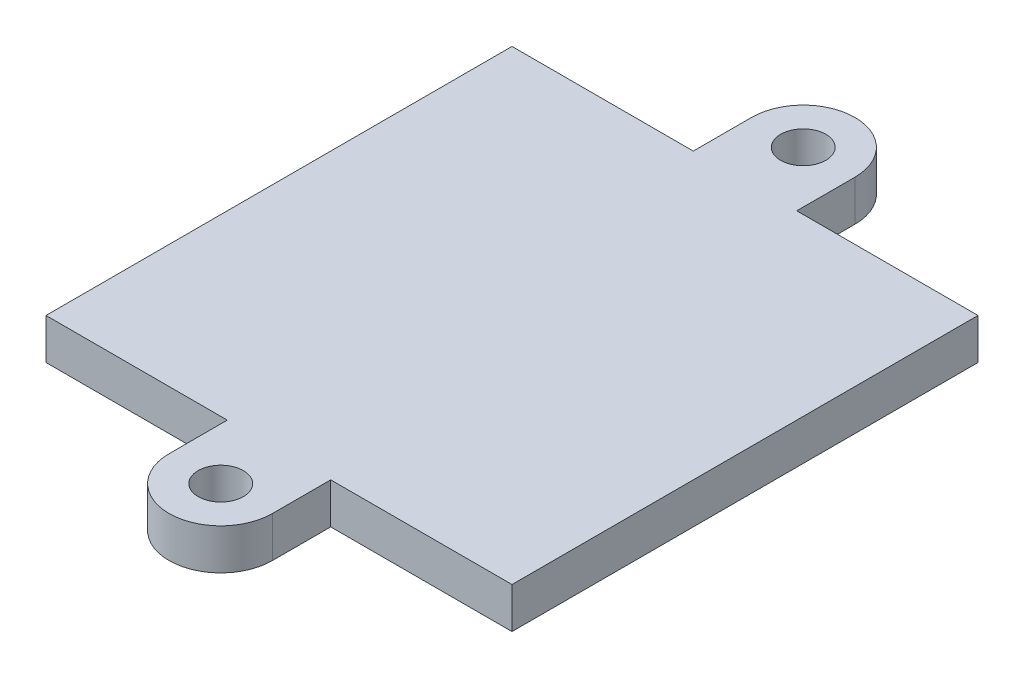
ISO-10303-21;
HEADER;
FILE_DESCRIPTION(('STEP AP214'),'2;1');
FILE_NAME('part.step','',(''),(''),'','','');
FILE_SCHEMA(('AUTOMOTIVE_DESIGN { 1 0 10303 214 1 1 1 1 }'));
ENDSEC;
DATA;
#1=APPLICATION_CONTEXT('core data for automotive mechanical design processes');
#2=APPLICATION_PROTOCOL_DEFINITION('international standard','automotive_design',2000,#1);
#3=PRODUCT_CONTEXT('',#1,'mechanical');
#4=PRODUCT('Part','Part','',(#3));
#5=PRODUCT_RELATED_PRODUCT_CATEGORY('part','',(#4));
#6=PRODUCT_DEFINITION_FORMATION('','',#4);
#7=PRODUCT_DEFINITION_CONTEXT('part definition',#1,'design');
#8=PRODUCT_DEFINITION('design','',#6,#7);
#9=PRODUCT_DEFINITION_SHAPE('','',#8);
#10=(LENGTH_UNIT() NAMED_UNIT(*) SI_UNIT(.MILLI.,.METRE.));
#11=(NAMED_UNIT(*) PLANE_ANGLE_UNIT() SI_UNIT($,.RADIAN.));
#12=(NAMED_UNIT(*) SI_UNIT($,.STERADIAN.) SOLID_ANGLE_UNIT());
#13=UNCERTAINTY_MEASURE_WITH_UNIT(LENGTH_MEASURE(1.E-05),#10,'distance_accuracy_value','');
#14=(GEOMETRIC_REPRESENTATION_CONTEXT(3) GLOBAL_UNCERTAINTY_ASSIGNED_CONTEXT((#13)) GLOBAL_UNIT_ASSIGNED_CONTEXT((#10,
#11,#12)) REPRESENTATION_CONTEXT('',''));
#15=CARTESIAN_POINT('',(0.,0.,0.));
#16=DIRECTION('',(0.,0.,1.));
#17=DIRECTION('',(1.,0.,0.));
#18=AXIS2_PLACEMENT_3D('',#15,#16,#17);
#19=CARTESIAN_POINT('',(0.,4.445,31.75));
#20=DIRECTION('',(0.,-1.,0.));
#21=DIRECTION('',(0.,0.,-1.));
#22=AXIS2_PLACEMENT_3D('',#19,#20,#21);
#23=CYLINDRICAL_SURFACE('',#22,5.6388);
#24=CARTESIAN_POINT('',(0.,0.,31.75));
#25=DIRECTION('',(0.,1.,0.));
#26=DIRECTION('',(0.,0.,1.));
#27=AXIS2_PLACEMENT_3D('',#24,#25,#26);
#28=CIRCLE('',#27,5.6388);
#29=CARTESIAN_POINT('',(5.6388,0.,31.75));
#30=VERTEX_POINT('',#29);
#31=CARTESIAN_POINT('',(-5.6388,0.,31.75));
#32=VERTEX_POINT('',#31);
#33=EDGE_CURVE('E157',#30,#32,#28,.F.);
#34=ORIENTED_EDGE('',*,*,#33,.F.);
#35=DIRECTION('',(0.,-1.,0.));
#36=VECTOR('',#35,1.);
#37=CARTESIAN_POINT('',(5.6388,4.445,31.75));
#38=LINE('',#37,#36);
#39=CARTESIAN_POINT('',(5.6388,4.445,31.75));
#40=VERTEX_POINT('',#39);
#41=EDGE_CURVE('E11',#40,#30,#38,.T.);
#42=ORIENTED_EDGE('',*,*,#41,.F.);
#43=CARTESIAN_POINT('',(0.,4.445,31.75));
#44=DIRECTION('',(0.,1.,0.));
#45=DIRECTION('',(0.,0.,1.));
#46=AXIS2_PLACEMENT_3D('',#43,#44,#45);
#47=CIRCLE('',#46,5.6388);
#48=CARTESIAN_POINT('',(-5.6388,4.445,31.75));
#49=VERTEX_POINT('',#48);
#50=EDGE_CURVE('E193',#40,#49,#47,.F.);
#51=ORIENTED_EDGE('',*,*,#50,.T.);
#52=DIRECTION('',(0.,-1.,0.));
#53=VECTOR('',#52,1.);
#54=CARTESIAN_POINT('',(-5.6388,4.445,31.75));
#55=LINE('',#54,#53);
#56=EDGE_CURVE('E49',#49,#32,#55,.T.);
#57=ORIENTED_EDGE('',*,*,#56,.T.);
#58=EDGE_LOOP('',(#34,#42,#51,#57));
#59=FACE_BOUND('',#58,.T.);
#60=ADVANCED_FACE('F33',(#59),#23,.T.);
#61=CARTESIAN_POINT('',(5.6388,4.445,0.));
#62=DIRECTION('',(-1.,0.,0.));
#63=DIRECTION('',(0.,0.,1.));
#64=AXIS2_PLACEMENT_3D('',#61,#62,#63);
#65=PLANE('',#64);
#66=DIRECTION('',(0.,0.,-1.));
#67=VECTOR('',#66,1.);
#68=CARTESIAN_POINT('',(5.6388,0.,0.));
#69=LINE('',#68,#67);
#70=CARTESIAN_POINT('',(5.6388,0.,25.3999999999999));
#71=VERTEX_POINT('',#70);
#72=EDGE_CURVE('E159',#30,#71,#69,.T.);
#73=ORIENTED_EDGE('',*,*,#72,.T.);
#74=DIRECTION('',(0.,-1.,0.));
#75=VECTOR('',#74,1.);
#76=CARTESIAN_POINT('',(5.6388,4.445,25.3999999999999));
#77=LINE('',#76,#75);
#78=CARTESIAN_POINT('',(5.6388,4.445,25.3999999999999));
#79=VERTEX_POINT('',#78);
#80=EDGE_CURVE('E41',#79,#71,#77,.T.);
#81=ORIENTED_EDGE('',*,*,#80,.F.);
#82=DIRECTION('',(0.,0.,-1.));
#83=VECTOR('',#82,1.);
#84=CARTESIAN_POINT('',(5.6388,4.445,0.));
#85=LINE('',#84,#83);
#86=EDGE_CURVE('E235',#40,#79,#85,.T.);
#87=ORIENTED_EDGE('',*,*,#86,.F.);
#88=ORIENTED_EDGE('',*,*,#41,.T.);
#89=EDGE_LOOP('',(#73,#81,#87,#88));
#90=FACE_BOUND('',#89,.T.);
#91=ADVANCED_FACE('F264',(#90),#65,.F.);
#92=CARTESIAN_POINT('',(-1.69458848553003E-13,4.445,25.3999999999999));
#93=DIRECTION('',(0.,0.,-1.));
#94=DIRECTION('',(-1.,0.,0.));
#95=AXIS2_PLACEMENT_3D('',#92,#93,#94);
#96=PLANE('',#95);
#97=DIRECTION('',(1.,0.,0.));
#98=VECTOR('',#97,1.);
#99=CARTESIAN_POINT('',(-1.69458848553003E-13,0.,25.3999999999999));
#100=LINE('',#99,#98);
#101=CARTESIAN_POINT('',(25.4000000000001,0.,25.4000000000001));
#102=VERTEX_POINT('',#101);
#103=EDGE_CURVE('E161',#71,#102,#100,.T.);
#104=ORIENTED_EDGE('',*,*,#103,.T.);
#105=DIRECTION('',(0.,-1.,0.));
#106=VECTOR('',#105,1.);
#107=CARTESIAN_POINT('',(25.4000000000001,4.445,25.4000000000001));
#108=LINE('',#107,#106);
#109=CARTESIAN_POINT('',(25.4000000000001,4.445,25.4000000000001));
#110=VERTEX_POINT('',#109);
#111=EDGE_CURVE('E208',#110,#102,#108,.T.);
#112=ORIENTED_EDGE('',*,*,#111,.F.);
#113=DIRECTION('',(1.,0.,0.));
#114=VECTOR('',#113,1.);
#115=CARTESIAN_POINT('',(-1.69458848553003E-13,4.445,25.3999999999999));
#116=LINE('',#115,#114);
#117=EDGE_CURVE('E216',#79,#110,#116,.T.);
#118=ORIENTED_EDGE('',*,*,#117,.F.);
#119=ORIENTED_EDGE('',*,*,#80,.T.);
#120=EDGE_LOOP('',(#104,#112,#118,#119));
#121=FACE_BOUND('',#120,.T.);
#122=ADVANCED_FACE('F214',(#121),#96,.F.);
#123=CARTESIAN_POINT('',(25.4000000000001,4.445,0.));
#124=DIRECTION('',(1.,0.,0.));
#125=DIRECTION('',(0.,0.,-1.));
#126=AXIS2_PLACEMENT_3D('',#123,#124,#125);
#127=PLANE('',#126);
#128=DIRECTION('',(0.,0.,1.));
#129=VECTOR('',#128,1.);
#130=CARTESIAN_POINT('',(25.4000000000001,0.,0.));
#131=LINE('',#130,#129);
#132=CARTESIAN_POINT('',(25.4000000000001,0.,-25.3999999999999));
#133=VERTEX_POINT('',#132);
#134=EDGE_CURVE('E164',#133,#102,#131,.T.);
#135=ORIENTED_EDGE('',*,*,#134,.F.);
#136=DIRECTION('',(0.,-1.,0.));
#137=VECTOR('',#136,1.);
#138=CARTESIAN_POINT('',(25.4000000000001,4.445,-25.3999999999999));
#139=LINE('',#138,#137);
#140=CARTESIAN_POINT('',(25.4000000000001,4.445,-25.3999999999999));
#141=VERTEX_POINT('',#140);
#142=EDGE_CURVE('E206',#141,#133,#139,.T.);
#143=ORIENTED_EDGE('',*,*,#142,.F.);
#144=DIRECTION('',(0.,0.,1.));
#145=VECTOR('',#144,1.);
#146=CARTESIAN_POINT('',(25.4000000000001,4.445,0.));
#147=LINE('',#146,#145);
#148=EDGE_CURVE('E228',#141,#110,#147,.T.);
#149=ORIENTED_EDGE('',*,*,#148,.T.);
#150=ORIENTED_EDGE('',*,*,#111,.T.);
#151=EDGE_LOOP('',(#135,#143,#149,#150));
#152=FACE_BOUND('',#151,.T.);
#153=ADVANCED_FACE('F225',(#152),#127,.T.);
#154=CARTESIAN_POINT('',(0.,4.445,-25.3999999999999));
#155=DIRECTION('',(0.,0.,-1.));
#156=DIRECTION('',(-1.,0.,0.));
#157=AXIS2_PLACEMENT_3D('',#154,#155,#156);
#158=PLANE('',#157);
#159=DIRECTION('',(1.,0.,0.));
#160=VECTOR('',#159,1.);
#161=CARTESIAN_POINT('',(0.,0.,-25.3999999999999));
#162=LINE('',#161,#160);
#163=CARTESIAN_POINT('',(5.6388,0.,-25.3999999999999));
#164=VERTEX_POINT('',#163);
#165=EDGE_CURVE('E167',#164,#133,#162,.T.);
#166=ORIENTED_EDGE('',*,*,#165,.F.);
#167=DIRECTION('',(0.,-1.,0.));
#168=VECTOR('',#167,1.);
#169=CARTESIAN_POINT('',(5.6388,4.445,-25.3999999999999));
#170=LINE('',#169,#168);
#171=CARTESIAN_POINT('',(5.6388,4.445,-25.3999999999999));
#172=VERTEX_POINT('',#171);
#173=EDGE_CURVE('E204',#172,#164,#170,.T.);
#174=ORIENTED_EDGE('',*,*,#173,.F.);
#175=DIRECTION('',(1.,0.,0.));
#176=VECTOR('',#175,1.);
#177=CARTESIAN_POINT('',(0.,4.445,-25.3999999999999));
#178=LINE('',#177,#176);
#179=EDGE_CURVE('E231',#172,#141,#178,.T.);
#180=ORIENTED_EDGE('',*,*,#179,.T.);
#181=ORIENTED_EDGE('',*,*,#142,.T.);
#182=EDGE_LOOP('',(#166,#174,#180,#181));
#183=FACE_BOUND('',#182,.T.);
#184=ADVANCED_FACE('F275',(#183),#158,.T.);
#185=CARTESIAN_POINT('',(5.6388,4.445,0.));
#186=DIRECTION('',(1.,0.,0.));
#187=DIRECTION('',(0.,0.,-1.));
#188=AXIS2_PLACEMENT_3D('',#185,#186,#187);
#189=PLANE('',#188);
#190=DIRECTION('',(0.,0.,1.));
#191=VECTOR('',#190,1.);
#192=CARTESIAN_POINT('',(5.6388,0.,0.));
#193=LINE('',#192,#191);
#194=CARTESIAN_POINT('',(5.6388,0.,-31.75));
#195=VERTEX_POINT('',#194);
#196=EDGE_CURVE('E170',#195,#164,#193,.T.);
#197=ORIENTED_EDGE('',*,*,#196,.F.);
#198=DIRECTION('',(0.,-1.,0.));
#199=VECTOR('',#198,1.);
#200=CARTESIAN_POINT('',(5.6388,4.445,-31.75));
#201=LINE('',#200,#199);
#202=CARTESIAN_POINT('',(5.6388,4.445,-31.75));
#203=VERTEX_POINT('',#202);
#204=EDGE_CURVE('E202',#203,#195,#201,.T.);
#205=ORIENTED_EDGE('',*,*,#204,.F.);
#206=DIRECTION('',(0.,0.,1.));
#207=VECTOR('',#206,1.);
#208=CARTESIAN_POINT('',(5.6388,4.445,0.));
#209=LINE('',#208,#207);
#210=EDGE_CURVE('E233',#203,#172,#209,.T.);
#211=ORIENTED_EDGE('',*,*,#210,.T.);
#212=ORIENTED_EDGE('',*,*,#173,.T.);
#213=EDGE_LOOP('',(#197,#205,#211,#212));
#214=FACE_BOUND('',#213,.T.);
#215=ADVANCED_FACE('F278',(#214),#189,.T.);
#216=CARTESIAN_POINT('',(0.,4.445,-31.75));
#217=DIRECTION('',(0.,-1.,0.));
#218=DIRECTION('',(0.,0.,-1.));
#219=AXIS2_PLACEMENT_3D('',#216,#217,#218);
#220=CYLINDRICAL_SURFACE('',#219,5.6388);
#221=CARTESIAN_POINT('',(0.,0.,-31.75));
#222=DIRECTION('',(0.,1.,0.));
#223=DIRECTION('',(0.,0.,1.));
#224=AXIS2_PLACEMENT_3D('',#221,#222,#223);
#225=CIRCLE('',#224,5.6388);
#226=CARTESIAN_POINT('',(-5.6388,0.,-31.75));
#227=VERTEX_POINT('',#226);
#228=EDGE_CURVE('E173',#195,#227,#225,.T.);
#229=ORIENTED_EDGE('',*,*,#228,.T.);
#230=DIRECTION('',(0.,-1.,0.));
#231=VECTOR('',#230,1.);
#232=CARTESIAN_POINT('',(-5.6388,4.445,-31.75));
#233=LINE('',#232,#231);
#234=CARTESIAN_POINT('',(-5.6388,4.445,-31.75));
#235=VERTEX_POINT('',#234);
#236=EDGE_CURVE('E199',#235,#227,#233,.T.);
#237=ORIENTED_EDGE('',*,*,#236,.F.);
#238=CARTESIAN_POINT('',(0.,4.445,-31.75));
#239=DIRECTION('',(0.,1.,0.));
#240=DIRECTION('',(0.,0.,1.));
#241=AXIS2_PLACEMENT_3D('',#238,#239,#240);
#242=CIRCLE('',#241,5.6388);
#243=EDGE_CURVE('E241',#203,#235,#242,.T.);
#244=ORIENTED_EDGE('',*,*,#243,.F.);
#245=ORIENTED_EDGE('',*,*,#204,.T.);
#246=EDGE_LOOP('',(#229,#237,#244,#245));
#247=FACE_BOUND('',#246,.T.);
#248=ADVANCED_FACE('F282',(#247),#220,.T.);
#249=CARTESIAN_POINT('',(-5.6388,4.445,0.));
#250=DIRECTION('',(1.,0.,0.));
#251=DIRECTION('',(0.,0.,-1.));
#252=AXIS2_PLACEMENT_3D('',#249,#250,#251);
#253=PLANE('',#252);
#254=DIRECTION('',(0.,0.,1.));
#255=VECTOR('',#254,1.);
#256=CARTESIAN_POINT('',(-5.6388,0.,0.));
#257=LINE('',#256,#255);
#258=CARTESIAN_POINT('',(-5.6388,0.,-25.3999999999999));
#259=VERTEX_POINT('',#258);
#260=EDGE_CURVE('E175',#227,#259,#257,.T.);
#261=ORIENTED_EDGE('',*,*,#260,.T.);
#262=DIRECTION('',(0.,-1.,0.));
#263=VECTOR('',#262,1.);
#264=CARTESIAN_POINT('',(-5.6388,4.445,-25.3999999999999));
#265=LINE('',#264,#263);
#266=CARTESIAN_POINT('',(-5.6388,4.445,-25.3999999999999));
#267=VERTEX_POINT('',#266);
#268=EDGE_CURVE('E197',#267,#259,#265,.T.);
#269=ORIENTED_EDGE('',*,*,#268,.F.);
#270=DIRECTION('',(0.,0.,1.));
#271=VECTOR('',#270,1.);
#272=CARTESIAN_POINT('',(-5.6388,4.445,0.));
#273=LINE('',#272,#271);
#274=EDGE_CURVE('E243',#235,#267,#273,.T.);
#275=ORIENTED_EDGE('',*,*,#274,.F.);
#276=ORIENTED_EDGE('',*,*,#236,.T.);
#277=EDGE_LOOP('',(#261,#269,#275,#276));
#278=FACE_BOUND('',#277,.T.);
#279=ADVANCED_FACE('F286',(#278),#253,.F.);
#280=CARTESIAN_POINT('',(0.,4.445,-25.3999999999999));
#281=DIRECTION('',(0.,0.,-1.));
#282=DIRECTION('',(-1.,0.,0.));
#283=AXIS2_PLACEMENT_3D('',#280,#281,#282);
#284=PLANE('',#283);
#285=DIRECTION('',(1.,0.,0.));
#286=VECTOR('',#285,1.);
#287=CARTESIAN_POINT('',(0.,0.,-25.3999999999999));
#288=LINE('',#287,#286);
#289=CARTESIAN_POINT('',(-25.4,0.,-25.3999999999999));
#290=VERTEX_POINT('',#289);
#291=EDGE_CURVE('E178',#290,#259,#288,.T.);
#292=ORIENTED_EDGE('',*,*,#291,.F.);
#293=DIRECTION('',(0.,-1.,0.));
#294=VECTOR('',#293,1.);
#295=CARTESIAN_POINT('',(-25.4,4.445,-25.3999999999999));
#296=LINE('',#295,#294);
#297=CARTESIAN_POINT('',(-25.4,4.445,-25.3999999999999));
#298=VERTEX_POINT('',#297);
#299=EDGE_CURVE('E143',#298,#290,#296,.T.);
#300=ORIENTED_EDGE('',*,*,#299,.F.);
#301=DIRECTION('',(1.,0.,0.));
#302=VECTOR('',#301,1.);
#303=CARTESIAN_POINT('',(0.,4.445,-25.3999999999999));
#304=LINE('',#303,#302);
#305=EDGE_CURVE('E133',#298,#267,#304,.T.);
#306=ORIENTED_EDGE('',*,*,#305,.T.);
#307=ORIENTED_EDGE('',*,*,#268,.T.);
#308=EDGE_LOOP('',(#292,#300,#306,#307));
#309=FACE_BOUND('',#308,.T.);
#310=ADVANCED_FACE('F246',(#309),#284,.T.);
#311=CARTESIAN_POINT('',(-25.4,4.445,0.));
#312=DIRECTION('',(1.,0.,0.));
#313=DIRECTION('',(0.,0.,-1.));
#314=AXIS2_PLACEMENT_3D('',#311,#312,#313);
#315=PLANE('',#314);
#316=DIRECTION('',(0.,0.,1.));
#317=VECTOR('',#316,1.);
#318=CARTESIAN_POINT('',(-25.4,0.,0.));
#319=LINE('',#318,#317);
#320=CARTESIAN_POINT('',(-25.4,0.,25.4000000000001));
#321=VERTEX_POINT('',#320);
#322=EDGE_CURVE('E140',#290,#321,#319,.T.);
#323=ORIENTED_EDGE('',*,*,#322,.T.);
#324=DIRECTION('',(0.,-1.,0.));
#325=VECTOR('',#324,1.);
#326=CARTESIAN_POINT('',(-25.4,4.445,25.4000000000001));
#327=LINE('',#326,#325);
#328=CARTESIAN_POINT('',(-25.4,4.445,25.4000000000001));
#329=VERTEX_POINT('',#328);
#330=EDGE_CURVE('E137',#329,#321,#327,.T.);
#331=ORIENTED_EDGE('',*,*,#330,.F.);
#332=DIRECTION('',(0.,0.,1.));
#333=VECTOR('',#332,1.);
#334=CARTESIAN_POINT('',(-25.4,4.445,0.));
#335=LINE('',#334,#333);
#336=EDGE_CURVE('E124',#298,#329,#335,.T.);
#337=ORIENTED_EDGE('',*,*,#336,.F.);
#338=ORIENTED_EDGE('',*,*,#299,.T.);
#339=EDGE_LOOP('',(#323,#331,#337,#338));
#340=FACE_BOUND('',#339,.T.);
#341=ADVANCED_FACE('F138',(#340),#315,.F.);
#342=CARTESIAN_POINT('',(1.69458848553004E-13,4.445,25.3999999999999));
#343=DIRECTION('',(0.,0.,-1.));
#344=DIRECTION('',(-1.,0.,0.));
#345=AXIS2_PLACEMENT_3D('',#342,#343,#344);
#346=PLANE('',#345);
#347=DIRECTION('',(1.,0.,0.));
#348=VECTOR('',#347,1.);
#349=CARTESIAN_POINT('',(1.69458848553004E-13,0.,25.3999999999999));
#350=LINE('',#349,#348);
#351=CARTESIAN_POINT('',(-5.6388,0.,25.3999999999999));
#352=VERTEX_POINT('',#351);
#353=EDGE_CURVE('E182',#321,#352,#350,.T.);
#354=ORIENTED_EDGE('',*,*,#353,.T.);
#355=DIRECTION('',(0.,-1.,0.));
#356=VECTOR('',#355,1.);
#357=CARTESIAN_POINT('',(-5.6388,4.445,25.3999999999999));
#358=LINE('',#357,#356);
#359=CARTESIAN_POINT('',(-5.6388,4.445,25.3999999999999));
#360=VERTEX_POINT('',#359);
#361=EDGE_CURVE('E87',#360,#352,#358,.T.);
#362=ORIENTED_EDGE('',*,*,#361,.F.);
#363=DIRECTION('',(1.,0.,0.));
#364=VECTOR('',#363,1.);
#365=CARTESIAN_POINT('',(1.69458848553004E-13,4.445,25.3999999999999));
#366=LINE('',#365,#364);
#367=EDGE_CURVE('E131',#329,#360,#366,.T.);
#368=ORIENTED_EDGE('',*,*,#367,.F.);
#369=ORIENTED_EDGE('',*,*,#330,.T.);
#370=EDGE_LOOP('',(#354,#362,#368,#369));
#371=FACE_BOUND('',#370,.T.);
#372=ADVANCED_FACE('F145',(#371),#346,.F.);
#373=CARTESIAN_POINT('',(0.,4.445,-31.75));
#374=DIRECTION('',(0.,-1.,0.));
#375=DIRECTION('',(0.,0.,-1.));
#376=AXIS2_PLACEMENT_3D('',#373,#374,#375);
#377=CYLINDRICAL_SURFACE('',#376,2.4638);
#378=CARTESIAN_POINT('',(0.,4.445,-31.75));
#379=DIRECTION('',(0.,1.,0.));
#380=DIRECTION('',(0.,0.,1.));
#381=AXIS2_PLACEMENT_3D('',#378,#379,#380);
#382=CIRCLE('',#381,2.4638);
#383=CARTESIAN_POINT('',(0.,4.445,-29.2862));
#384=VERTEX_POINT('',#383);
#385=EDGE_CURVE('E148',#384,#384,#382,.T.);
#386=ORIENTED_EDGE('',*,*,#385,.T.);
#387=EDGE_LOOP('',(#386));
#388=FACE_BOUND('',#387,.T.);
#389=CARTESIAN_POINT('',(0.,0.,-31.75));
#390=DIRECTION('',(0.,1.,0.));
#391=DIRECTION('',(0.,0.,1.));
#392=AXIS2_PLACEMENT_3D('',#389,#390,#391);
#393=CIRCLE('',#392,2.4638);
#394=CARTESIAN_POINT('',(0.,0.,-29.2862));
#395=VERTEX_POINT('',#394);
#396=EDGE_CURVE('E187',#395,#395,#393,.T.);
#397=ORIENTED_EDGE('',*,*,#396,.F.);
#398=EDGE_LOOP('',(#397));
#399=FACE_BOUND('',#398,.T.);
#400=ADVANCED_FACE('F252',(#388,#399),#377,.F.);
#401=CARTESIAN_POINT('',(-5.6388,4.445,0.));
#402=DIRECTION('',(-1.,0.,0.));
#403=DIRECTION('',(0.,0.,1.));
#404=AXIS2_PLACEMENT_3D('',#401,#402,#403);
#405=PLANE('',#404);
#406=DIRECTION('',(0.,0.,-1.));
#407=VECTOR('',#406,1.);
#408=CARTESIAN_POINT('',(-5.6388,0.,0.));
#409=LINE('',#408,#407);
#410=EDGE_CURVE('E184',#32,#352,#409,.T.);
#411=ORIENTED_EDGE('',*,*,#410,.F.);
#412=ORIENTED_EDGE('',*,*,#56,.F.);
#413=DIRECTION('',(0.,0.,-1.));
#414=VECTOR('',#413,1.);
#415=CARTESIAN_POINT('',(-5.6388,4.445,0.));
#416=LINE('',#415,#414);
#417=EDGE_CURVE('E146',#49,#360,#416,.T.);
#418=ORIENTED_EDGE('',*,*,#417,.T.);
#419=ORIENTED_EDGE('',*,*,#361,.T.);
#420=EDGE_LOOP('',(#411,#412,#418,#419));
#421=FACE_BOUND('',#420,.T.);
#422=ADVANCED_FACE('F249',(#421),#405,.T.);
#423=CARTESIAN_POINT('',(0.,4.445,31.75));
#424=DIRECTION('',(0.,-1.,0.));
#425=DIRECTION('',(0.,0.,-1.));
#426=AXIS2_PLACEMENT_3D('',#423,#424,#425);
#427=CYLINDRICAL_SURFACE('',#426,2.4638);
#428=CARTESIAN_POINT('',(0.,4.445,31.75));
#429=DIRECTION('',(0.,1.,0.));
#430=DIRECTION('',(0.,0.,1.));
#431=AXIS2_PLACEMENT_3D('',#428,#429,#430);
#432=CIRCLE('',#431,2.4638);
#433=CARTESIAN_POINT('',(0.,4.445,34.2138));
#434=VERTEX_POINT('',#433);
#435=EDGE_CURVE('E154',#434,#434,#432,.F.);
#436=ORIENTED_EDGE('',*,*,#435,.F.);
#437=EDGE_LOOP('',(#436));
#438=FACE_BOUND('',#437,.T.);
#439=CARTESIAN_POINT('',(0.,0.,31.75));
#440=DIRECTION('',(0.,1.,0.));
#441=DIRECTION('',(0.,0.,1.));
#442=AXIS2_PLACEMENT_3D('',#439,#440,#441);
#443=CIRCLE('',#442,2.4638);
#444=CARTESIAN_POINT('',(0.,0.,34.2138));
#445=VERTEX_POINT('',#444);
#446=EDGE_CURVE('E190',#445,#445,#443,.F.);
#447=ORIENTED_EDGE('',*,*,#446,.T.);
#448=EDGE_LOOP('',(#447));
#449=FACE_BOUND('',#448,.T.);
#450=ADVANCED_FACE('F251',(#438,#449),#427,.F.);
#451=CARTESIAN_POINT('',(0.,4.445,0.));
#452=DIRECTION('',(0.,1.,0.));
#453=DIRECTION('',(0.,0.,1.));
#454=AXIS2_PLACEMENT_3D('',#451,#452,#453);
#455=PLANE('',#454);
#456=ORIENTED_EDGE('',*,*,#50,.F.);
#457=ORIENTED_EDGE('',*,*,#86,.T.);
#458=ORIENTED_EDGE('',*,*,#117,.T.);
#459=ORIENTED_EDGE('',*,*,#148,.F.);
#460=ORIENTED_EDGE('',*,*,#179,.F.);
#461=ORIENTED_EDGE('',*,*,#210,.F.);
#462=ORIENTED_EDGE('',*,*,#243,.T.);
#463=ORIENTED_EDGE('',*,*,#274,.T.);
#464=ORIENTED_EDGE('',*,*,#305,.F.);
#465=ORIENTED_EDGE('',*,*,#336,.T.);
#466=ORIENTED_EDGE('',*,*,#367,.T.);
#467=ORIENTED_EDGE('',*,*,#417,.F.);
#468=EDGE_LOOP('',(#456,#457,#458,#459,#460,#461,#462,#463,#464,#465,#466,#467));
#469=FACE_BOUND('',#468,.T.);
#470=ORIENTED_EDGE('',*,*,#385,.F.);
#471=EDGE_LOOP('',(#470));
#472=FACE_BOUND('',#471,.T.);
#473=ORIENTED_EDGE('',*,*,#435,.T.);
#474=EDGE_LOOP('',(#473));
#475=FACE_BOUND('',#474,.T.);
#476=ADVANCED_FACE('F127',(#469,#472,#475),#455,.T.);
#477=CARTESIAN_POINT('',(0.,0.,0.));
#478=DIRECTION('',(0.,1.,0.));
#479=DIRECTION('',(0.,0.,1.));
#480=AXIS2_PLACEMENT_3D('',#477,#478,#479);
#481=PLANE('',#480);
#482=ORIENTED_EDGE('',*,*,#33,.T.);
#483=ORIENTED_EDGE('',*,*,#410,.T.);
#484=ORIENTED_EDGE('',*,*,#353,.F.);
#485=ORIENTED_EDGE('',*,*,#322,.F.);
#486=ORIENTED_EDGE('',*,*,#291,.T.);
#487=ORIENTED_EDGE('',*,*,#260,.F.);
#488=ORIENTED_EDGE('',*,*,#228,.F.);
#489=ORIENTED_EDGE('',*,*,#196,.T.);
#490=ORIENTED_EDGE('',*,*,#165,.T.);
#491=ORIENTED_EDGE('',*,*,#134,.T.);
#492=ORIENTED_EDGE('',*,*,#103,.F.);
#493=ORIENTED_EDGE('',*,*,#72,.F.);
#494=EDGE_LOOP('',(#482,#483,#484,#485,#486,#487,#488,#489,#490,#491,#492,#493));
#495=FACE_BOUND('',#494,.T.);
#496=ORIENTED_EDGE('',*,*,#396,.T.);
#497=EDGE_LOOP('',(#496));
#498=FACE_BOUND('',#497,.T.);
#499=ORIENTED_EDGE('',*,*,#446,.F.);
#500=EDGE_LOOP('',(#499));
#501=FACE_BOUND('',#500,.T.);
#502=ADVANCED_FACE('F220',(#495,#498,#501),#481,.F.);
#503=CLOSED_SHELL('',(#60,#91,#122,#153,#184,#215,#248,#279,#310,#341,#372,#400,#422,#450,#476,#502));
#504=MANIFOLD_SOLID_BREP('B2',#503);
#505=ADVANCED_BREP_SHAPE_REPRESENTATION('',(#18,#504),#14);
#506=SHAPE_DEFINITION_REPRESENTATION(#9,#505);
ENDSEC;
END-ISO-10303-21;
